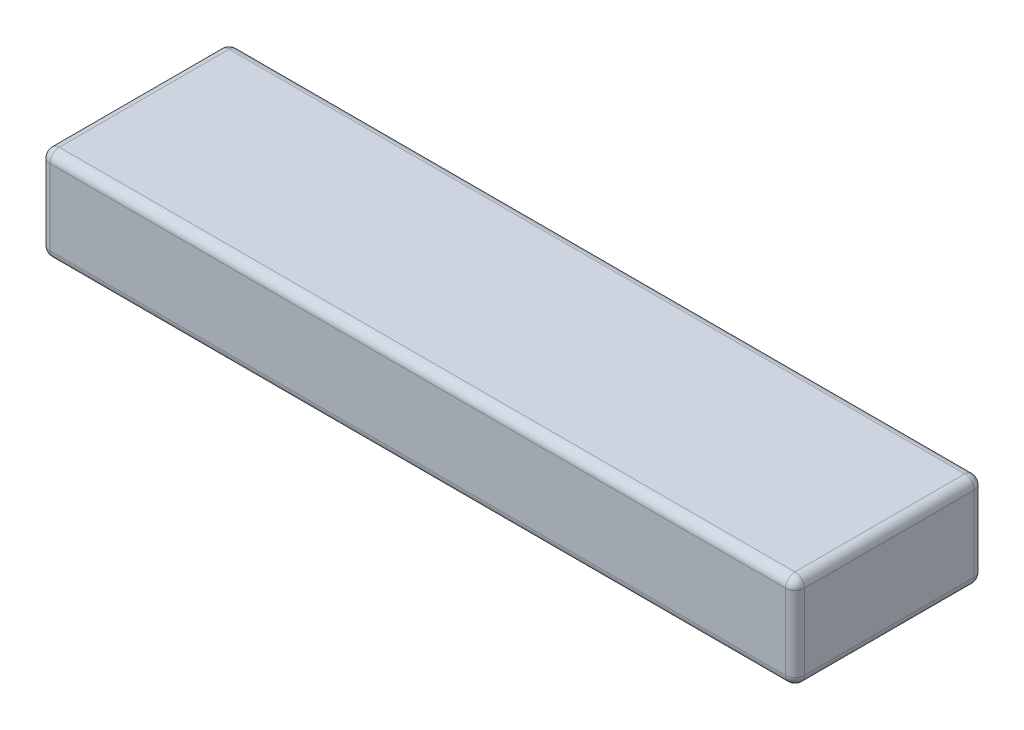
ISO-10303-21;
HEADER;
FILE_DESCRIPTION(('STEP AP214'),'2;1');
FILE_NAME('part.step','',(''),(''),'','','');
FILE_SCHEMA(('AUTOMOTIVE_DESIGN { 1 0 10303 214 1 1 1 1 }'));
ENDSEC;
DATA;
#1=APPLICATION_CONTEXT('core data for automotive mechanical design processes');
#2=APPLICATION_PROTOCOL_DEFINITION('international standard','automotive_design',2000,#1);
#3=PRODUCT_CONTEXT('',#1,'mechanical');
#4=PRODUCT('Part','Part','',(#3));
#5=PRODUCT_RELATED_PRODUCT_CATEGORY('part','',(#4));
#6=PRODUCT_DEFINITION_FORMATION('','',#4);
#7=PRODUCT_DEFINITION_CONTEXT('part definition',#1,'design');
#8=PRODUCT_DEFINITION('design','',#6,#7);
#9=PRODUCT_DEFINITION_SHAPE('','',#8);
#10=(LENGTH_UNIT() NAMED_UNIT(*) SI_UNIT(.MILLI.,.METRE.));
#11=(NAMED_UNIT(*) PLANE_ANGLE_UNIT() SI_UNIT($,.RADIAN.));
#12=(NAMED_UNIT(*) SI_UNIT($,.STERADIAN.) SOLID_ANGLE_UNIT());
#13=UNCERTAINTY_MEASURE_WITH_UNIT(LENGTH_MEASURE(1.E-05),#10,'distance_accuracy_value','');
#14=(GEOMETRIC_REPRESENTATION_CONTEXT(3) GLOBAL_UNCERTAINTY_ASSIGNED_CONTEXT((#13)) GLOBAL_UNIT_ASSIGNED_CONTEXT((#10,
#11,#12)) REPRESENTATION_CONTEXT('',''));
#15=CARTESIAN_POINT('',(0.,0.,0.));
#16=DIRECTION('',(0.,0.,1.));
#17=DIRECTION('',(1.,0.,0.));
#18=AXIS2_PLACEMENT_3D('',#15,#16,#17);
#19=CARTESIAN_POINT('',(-20.,5.,5.));
#20=DIRECTION('',(1.,0.,0.));
#21=DIRECTION('',(0.,0.,-1.));
#22=AXIS2_PLACEMENT_3D('',#19,#20,#21);
#23=PLANE('',#22);
#24=DIRECTION('',(0.,0.,1.));
#25=VECTOR('',#24,1.);
#26=CARTESIAN_POINT('',(-20.,4.5,-5.));
#27=LINE('',#26,#25);
#28=CARTESIAN_POINT('',(-20.,4.5,4.5));
#29=VERTEX_POINT('',#28);
#30=CARTESIAN_POINT('',(-20.,4.5,-4.5));
#31=VERTEX_POINT('',#30);
#32=EDGE_CURVE('E196',#29,#31,#27,.F.);
#33=ORIENTED_EDGE('',*,*,#32,.T.);
#34=DIRECTION('',(0.,-1.,0.));
#35=VECTOR('',#34,1.);
#36=CARTESIAN_POINT('',(-20.,5.,-4.5));
#37=LINE('',#36,#35);
#38=CARTESIAN_POINT('',(-20.,0.5,-4.5));
#39=VERTEX_POINT('',#38);
#40=EDGE_CURVE('E153',#31,#39,#37,.T.);
#41=ORIENTED_EDGE('',*,*,#40,.T.);
#42=DIRECTION('',(0.,0.,1.));
#43=VECTOR('',#42,1.);
#44=CARTESIAN_POINT('',(-20.,0.5,5.));
#45=LINE('',#44,#43);
#46=CARTESIAN_POINT('',(-20.,0.5,4.5));
#47=VERTEX_POINT('',#46);
#48=EDGE_CURVE('E202',#39,#47,#45,.T.);
#49=ORIENTED_EDGE('',*,*,#48,.T.);
#50=DIRECTION('',(0.,-1.,0.));
#51=VECTOR('',#50,1.);
#52=CARTESIAN_POINT('',(-20.,5.,4.5));
#53=LINE('',#52,#51);
#54=EDGE_CURVE('E199',#47,#29,#53,.F.);
#55=ORIENTED_EDGE('',*,*,#54,.T.);
#56=EDGE_LOOP('',(#33,#41,#49,#55));
#57=FACE_BOUND('',#56,.T.);
#58=ADVANCED_FACE('F43',(#57),#23,.F.);
#59=CARTESIAN_POINT('',(20.,5.,5.));
#60=DIRECTION('',(0.,0.,-1.));
#61=DIRECTION('',(-1.,0.,0.));
#62=AXIS2_PLACEMENT_3D('',#59,#60,#61);
#63=PLANE('',#62);
#64=DIRECTION('',(0.,-1.,0.));
#65=VECTOR('',#64,1.);
#66=CARTESIAN_POINT('',(-19.5,5.,5.));
#67=LINE('',#66,#65);
#68=CARTESIAN_POINT('',(-19.5,4.5,5.));
#69=VERTEX_POINT('',#68);
#70=CARTESIAN_POINT('',(-19.5,0.5,5.));
#71=VERTEX_POINT('',#70);
#72=EDGE_CURVE('E226',#69,#71,#67,.T.);
#73=ORIENTED_EDGE('',*,*,#72,.T.);
#74=DIRECTION('',(1.,0.,0.));
#75=VECTOR('',#74,1.);
#76=CARTESIAN_POINT('',(20.,0.5,5.));
#77=LINE('',#76,#75);
#78=CARTESIAN_POINT('',(19.5,0.5,5.));
#79=VERTEX_POINT('',#78);
#80=EDGE_CURVE('E230',#71,#79,#77,.T.);
#81=ORIENTED_EDGE('',*,*,#80,.T.);
#82=DIRECTION('',(0.,-1.,0.));
#83=VECTOR('',#82,1.);
#84=CARTESIAN_POINT('',(19.5,5.,5.));
#85=LINE('',#84,#83);
#86=CARTESIAN_POINT('',(19.5,4.5,5.));
#87=VERTEX_POINT('',#86);
#88=EDGE_CURVE('E223',#79,#87,#85,.F.);
#89=ORIENTED_EDGE('',*,*,#88,.T.);
#90=DIRECTION('',(1.,0.,0.));
#91=VECTOR('',#90,1.);
#92=CARTESIAN_POINT('',(-20.,4.5,5.));
#93=LINE('',#92,#91);
#94=EDGE_CURVE('E220',#87,#69,#93,.F.);
#95=ORIENTED_EDGE('',*,*,#94,.T.);
#96=EDGE_LOOP('',(#73,#81,#89,#95));
#97=FACE_BOUND('',#96,.T.);
#98=ADVANCED_FACE('F333',(#97),#63,.F.);
#99=CARTESIAN_POINT('',(20.,5.,5.));
#100=DIRECTION('',(-1.,0.,0.));
#101=DIRECTION('',(0.,0.,1.));
#102=AXIS2_PLACEMENT_3D('',#99,#100,#101);
#103=PLANE('',#102);
#104=DIRECTION('',(0.,0.,-1.));
#105=VECTOR('',#104,1.);
#106=CARTESIAN_POINT('',(20.,0.5,5.));
#107=LINE('',#106,#105);
#108=CARTESIAN_POINT('',(20.,0.5,4.5));
#109=VERTEX_POINT('',#108);
#110=CARTESIAN_POINT('',(20.,0.5,-4.5));
#111=VERTEX_POINT('',#110);
#112=EDGE_CURVE('E189',#109,#111,#107,.T.);
#113=ORIENTED_EDGE('',*,*,#112,.T.);
#114=DIRECTION('',(0.,-1.,0.));
#115=VECTOR('',#114,1.);
#116=CARTESIAN_POINT('',(20.,5.,-4.5));
#117=LINE('',#116,#115);
#118=CARTESIAN_POINT('',(20.,4.5,-4.5));
#119=VERTEX_POINT('',#118);
#120=EDGE_CURVE('E192',#111,#119,#117,.F.);
#121=ORIENTED_EDGE('',*,*,#120,.T.);
#122=DIRECTION('',(0.,0.,-1.));
#123=VECTOR('',#122,1.);
#124=CARTESIAN_POINT('',(20.,4.5,5.));
#125=LINE('',#124,#123);
#126=CARTESIAN_POINT('',(20.,4.5,4.5));
#127=VERTEX_POINT('',#126);
#128=EDGE_CURVE('E183',#119,#127,#125,.F.);
#129=ORIENTED_EDGE('',*,*,#128,.T.);
#130=DIRECTION('',(0.,-1.,0.));
#131=VECTOR('',#130,1.);
#132=CARTESIAN_POINT('',(20.,5.,4.5));
#133=LINE('',#132,#131);
#134=EDGE_CURVE('E186',#127,#109,#133,.T.);
#135=ORIENTED_EDGE('',*,*,#134,.T.);
#136=EDGE_LOOP('',(#113,#121,#129,#135));
#137=FACE_BOUND('',#136,.T.);
#138=ADVANCED_FACE('F360',(#137),#103,.F.);
#139=CARTESIAN_POINT('',(20.,5.,-5.));
#140=DIRECTION('',(0.,0.,1.));
#141=DIRECTION('',(1.,0.,0.));
#142=AXIS2_PLACEMENT_3D('',#139,#140,#141);
#143=PLANE('',#142);
#144=DIRECTION('',(0.,-1.,0.));
#145=VECTOR('',#144,1.);
#146=CARTESIAN_POINT('',(19.5,5.,-5.));
#147=LINE('',#146,#145);
#148=CARTESIAN_POINT('',(19.5,4.5,-5.));
#149=VERTEX_POINT('',#148);
#150=CARTESIAN_POINT('',(19.5,0.5,-5.));
#151=VERTEX_POINT('',#150);
#152=EDGE_CURVE('E145',#149,#151,#147,.T.);
#153=ORIENTED_EDGE('',*,*,#152,.T.);
#154=DIRECTION('',(-1.,0.,0.));
#155=VECTOR('',#154,1.);
#156=CARTESIAN_POINT('',(20.,0.5,-5.));
#157=LINE('',#156,#155);
#158=CARTESIAN_POINT('',(-19.5,0.5,-5.));
#159=VERTEX_POINT('',#158);
#160=EDGE_CURVE('E140',#151,#159,#157,.T.);
#161=ORIENTED_EDGE('',*,*,#160,.T.);
#162=DIRECTION('',(0.,-1.,0.));
#163=VECTOR('',#162,1.);
#164=CARTESIAN_POINT('',(-19.5,5.,-5.));
#165=LINE('',#164,#163);
#166=CARTESIAN_POINT('',(-19.5,4.5,-5.));
#167=VERTEX_POINT('',#166);
#168=EDGE_CURVE('E132',#159,#167,#165,.F.);
#169=ORIENTED_EDGE('',*,*,#168,.T.);
#170=DIRECTION('',(-1.,0.,0.));
#171=VECTOR('',#170,1.);
#172=CARTESIAN_POINT('',(20.,4.5,-5.));
#173=LINE('',#172,#171);
#174=EDGE_CURVE('E137',#167,#149,#173,.F.);
#175=ORIENTED_EDGE('',*,*,#174,.T.);
#176=EDGE_LOOP('',(#153,#161,#169,#175));
#177=FACE_BOUND('',#176,.T.);
#178=ADVANCED_FACE('F135',(#177),#143,.F.);
#179=CARTESIAN_POINT('',(0.,5.,0.));
#180=DIRECTION('',(0.,1.,0.));
#181=DIRECTION('',(0.,0.,1.));
#182=AXIS2_PLACEMENT_3D('',#179,#180,#181);
#183=PLANE('',#182);
#184=DIRECTION('',(0.,0.,-1.));
#185=VECTOR('',#184,1.);
#186=CARTESIAN_POINT('',(19.5,5.,-5.));
#187=LINE('',#186,#185);
#188=CARTESIAN_POINT('',(19.5,5.,4.5));
#189=VERTEX_POINT('',#188);
#190=CARTESIAN_POINT('',(19.5,5.,-4.5));
#191=VERTEX_POINT('',#190);
#192=EDGE_CURVE('E53',#189,#191,#187,.T.);
#193=ORIENTED_EDGE('',*,*,#192,.T.);
#194=DIRECTION('',(-1.,0.,0.));
#195=VECTOR('',#194,1.);
#196=CARTESIAN_POINT('',(-20.,5.,-4.5));
#197=LINE('',#196,#195);
#198=CARTESIAN_POINT('',(-19.5,5.,-4.5));
#199=VERTEX_POINT('',#198);
#200=EDGE_CURVE('E11',#191,#199,#197,.T.);
#201=ORIENTED_EDGE('',*,*,#200,.T.);
#202=DIRECTION('',(0.,0.,1.));
#203=VECTOR('',#202,1.);
#204=CARTESIAN_POINT('',(-19.5,5.,5.));
#205=LINE('',#204,#203);
#206=CARTESIAN_POINT('',(-19.5,5.,4.5));
#207=VERTEX_POINT('',#206);
#208=EDGE_CURVE('E233',#199,#207,#205,.T.);
#209=ORIENTED_EDGE('',*,*,#208,.T.);
#210=DIRECTION('',(1.,0.,0.));
#211=VECTOR('',#210,1.);
#212=CARTESIAN_POINT('',(20.,5.,4.5));
#213=LINE('',#212,#211);
#214=EDGE_CURVE('E64',#207,#189,#213,.T.);
#215=ORIENTED_EDGE('',*,*,#214,.T.);
#216=EDGE_LOOP('',(#193,#201,#209,#215));
#217=FACE_BOUND('',#216,.T.);
#218=ADVANCED_FACE('F422',(#217),#183,.T.);
#219=CARTESIAN_POINT('',(0.,0.,0.));
#220=DIRECTION('',(0.,1.,0.));
#221=DIRECTION('',(0.,0.,1.));
#222=AXIS2_PLACEMENT_3D('',#219,#220,#221);
#223=PLANE('',#222);
#224=DIRECTION('',(-1.,0.,0.));
#225=VECTOR('',#224,1.);
#226=CARTESIAN_POINT('',(0.,0.,-4.5));
#227=LINE('',#226,#225);
#228=CARTESIAN_POINT('',(-19.5,0.,-4.5));
#229=VERTEX_POINT('',#228);
#230=CARTESIAN_POINT('',(19.5,0.,-4.5));
#231=VERTEX_POINT('',#230);
#232=EDGE_CURVE('E213',#229,#231,#227,.F.);
#233=ORIENTED_EDGE('',*,*,#232,.T.);
#234=DIRECTION('',(0.,0.,-1.));
#235=VECTOR('',#234,1.);
#236=CARTESIAN_POINT('',(19.5,0.,0.));
#237=LINE('',#236,#235);
#238=CARTESIAN_POINT('',(19.5,0.,4.5));
#239=VERTEX_POINT('',#238);
#240=EDGE_CURVE('E216',#231,#239,#237,.F.);
#241=ORIENTED_EDGE('',*,*,#240,.T.);
#242=DIRECTION('',(1.,0.,0.));
#243=VECTOR('',#242,1.);
#244=CARTESIAN_POINT('',(0.,0.,4.5));
#245=LINE('',#244,#243);
#246=CARTESIAN_POINT('',(-19.5,0.,4.5));
#247=VERTEX_POINT('',#246);
#248=EDGE_CURVE('E207',#239,#247,#245,.F.);
#249=ORIENTED_EDGE('',*,*,#248,.T.);
#250=DIRECTION('',(0.,0.,1.));
#251=VECTOR('',#250,1.);
#252=CARTESIAN_POINT('',(-19.5,0.,0.));
#253=LINE('',#252,#251);
#254=EDGE_CURVE('E210',#247,#229,#253,.F.);
#255=ORIENTED_EDGE('',*,*,#254,.T.);
#256=EDGE_LOOP('',(#233,#241,#249,#255));
#257=FACE_BOUND('',#256,.T.);
#258=ADVANCED_FACE('F324',(#257),#223,.F.);
#259=CARTESIAN_POINT('',(-19.5,5.,4.5));
#260=DIRECTION('',(0.,-1.,0.));
#261=DIRECTION('',(0.,0.,-1.));
#262=AXIS2_PLACEMENT_3D('',#259,#260,#261);
#263=CYLINDRICAL_SURFACE('',#262,0.5);
#264=CARTESIAN_POINT('',(-19.5,4.5,4.5));
#265=DIRECTION('',(0.,1.,0.));
#266=DIRECTION('',(0.,0.,1.));
#267=AXIS2_PLACEMENT_3D('',#264,#265,#266);
#268=CIRCLE('',#267,0.5);
#269=EDGE_CURVE('E47',#29,#69,#268,.T.);
#270=ORIENTED_EDGE('',*,*,#269,.F.);
#271=ORIENTED_EDGE('',*,*,#54,.F.);
#272=CARTESIAN_POINT('',(-19.5,0.5,4.5));
#273=DIRECTION('',(0.,-1.,0.));
#274=DIRECTION('',(0.,0.,-1.));
#275=AXIS2_PLACEMENT_3D('',#272,#273,#274);
#276=CIRCLE('',#275,0.5);
#277=EDGE_CURVE('E177',#71,#47,#276,.T.);
#278=ORIENTED_EDGE('',*,*,#277,.F.);
#279=ORIENTED_EDGE('',*,*,#72,.F.);
#280=EDGE_LOOP('',(#270,#271,#278,#279));
#281=FACE_BOUND('',#280,.T.);
#282=ADVANCED_FACE('F45',(#281),#263,.T.);
#283=CARTESIAN_POINT('',(-19.5,4.5,4.5));
#284=DIRECTION('',(0.,0.,1.));
#285=DIRECTION('',(1.,0.,0.));
#286=AXIS2_PLACEMENT_3D('',#283,#284,#285);
#287=SPHERICAL_SURFACE('',#286,0.5);
#288=CARTESIAN_POINT('',(-19.5,4.5,4.5));
#289=DIRECTION('',(0.,0.,1.));
#290=DIRECTION('',(1.,0.,0.));
#291=AXIS2_PLACEMENT_3D('',#288,#289,#290);
#292=CIRCLE('',#291,0.5);
#293=EDGE_CURVE('E300',#29,#207,#292,.F.);
#294=ORIENTED_EDGE('',*,*,#293,.F.);
#295=ORIENTED_EDGE('',*,*,#269,.T.);
#296=CARTESIAN_POINT('',(-19.5,4.5,4.5));
#297=DIRECTION('',(-1.,0.,0.));
#298=DIRECTION('',(0.,0.,1.));
#299=AXIS2_PLACEMENT_3D('',#296,#297,#298);
#300=CIRCLE('',#299,0.5);
#301=EDGE_CURVE('E304',#207,#69,#300,.F.);
#302=ORIENTED_EDGE('',*,*,#301,.F.);
#303=EDGE_LOOP('',(#294,#295,#302));
#304=FACE_BOUND('',#303,.T.);
#305=ADVANCED_FACE('F350',(#304),#287,.T.);
#306=CARTESIAN_POINT('',(-19.5,0.5,4.5));
#307=DIRECTION('',(-1.,0.,0.));
#308=DIRECTION('',(0.,-1.,0.));
#309=AXIS2_PLACEMENT_3D('',#306,#307,#308);
#310=SPHERICAL_SURFACE('',#309,0.5);
#311=CARTESIAN_POINT('',(-19.5,0.5,4.5));
#312=DIRECTION('',(-1.,0.,0.));
#313=DIRECTION('',(0.,0.,1.));
#314=AXIS2_PLACEMENT_3D('',#311,#312,#313);
#315=CIRCLE('',#314,0.5);
#316=EDGE_CURVE('E292',#71,#247,#315,.F.);
#317=ORIENTED_EDGE('',*,*,#316,.F.);
#318=ORIENTED_EDGE('',*,*,#277,.T.);
#319=CARTESIAN_POINT('',(-19.5,0.5,4.5));
#320=DIRECTION('',(0.,0.,1.));
#321=DIRECTION('',(1.,0.,0.));
#322=AXIS2_PLACEMENT_3D('',#319,#320,#321);
#323=CIRCLE('',#322,0.5);
#324=EDGE_CURVE('E296',#247,#47,#323,.F.);
#325=ORIENTED_EDGE('',*,*,#324,.F.);
#326=EDGE_LOOP('',(#317,#318,#325));
#327=FACE_BOUND('',#326,.T.);
#328=ADVANCED_FACE('F313',(#327),#310,.T.);
#329=CARTESIAN_POINT('',(0.,4.5,4.5));
#330=DIRECTION('',(-1.,0.,0.));
#331=DIRECTION('',(0.,0.,1.));
#332=AXIS2_PLACEMENT_3D('',#329,#330,#331);
#333=CYLINDRICAL_SURFACE('',#332,0.5);
#334=ORIENTED_EDGE('',*,*,#301,.T.);
#335=ORIENTED_EDGE('',*,*,#94,.F.);
#336=CARTESIAN_POINT('',(19.5,4.5,4.5));
#337=DIRECTION('',(1.,0.,0.));
#338=DIRECTION('',(0.,0.,-1.));
#339=AXIS2_PLACEMENT_3D('',#336,#337,#338);
#340=CIRCLE('',#339,0.5);
#341=EDGE_CURVE('E284',#189,#87,#340,.T.);
#342=ORIENTED_EDGE('',*,*,#341,.F.);
#343=ORIENTED_EDGE('',*,*,#214,.F.);
#344=EDGE_LOOP('',(#334,#335,#342,#343));
#345=FACE_BOUND('',#344,.T.);
#346=ADVANCED_FACE('F345',(#345),#333,.T.);
#347=CARTESIAN_POINT('',(-19.5,4.5,0.));
#348=DIRECTION('',(0.,0.,-1.));
#349=DIRECTION('',(-1.,0.,0.));
#350=AXIS2_PLACEMENT_3D('',#347,#348,#349);
#351=CYLINDRICAL_SURFACE('',#350,0.5);
#352=ORIENTED_EDGE('',*,*,#293,.T.);
#353=ORIENTED_EDGE('',*,*,#208,.F.);
#354=CARTESIAN_POINT('',(-19.5,4.5,-4.5));
#355=DIRECTION('',(0.,0.,-1.));
#356=DIRECTION('',(-1.,0.,0.));
#357=AXIS2_PLACEMENT_3D('',#354,#355,#356);
#358=CIRCLE('',#357,0.5);
#359=EDGE_CURVE('E158',#31,#199,#358,.T.);
#360=ORIENTED_EDGE('',*,*,#359,.F.);
#361=ORIENTED_EDGE('',*,*,#32,.F.);
#362=EDGE_LOOP('',(#352,#353,#360,#361));
#363=FACE_BOUND('',#362,.T.);
#364=ADVANCED_FACE('F353',(#363),#351,.T.);
#365=CARTESIAN_POINT('',(-19.5,5.,-4.5));
#366=DIRECTION('',(0.,-1.,0.));
#367=DIRECTION('',(0.,0.,-1.));
#368=AXIS2_PLACEMENT_3D('',#365,#366,#367);
#369=CYLINDRICAL_SURFACE('',#368,0.5);
#370=CARTESIAN_POINT('',(-19.5,0.5,-4.5));
#371=DIRECTION('',(0.,-1.,0.));
#372=DIRECTION('',(0.,0.,-1.));
#373=AXIS2_PLACEMENT_3D('',#370,#371,#372);
#374=CIRCLE('',#373,0.5);
#375=EDGE_CURVE('E159',#39,#159,#374,.T.);
#376=ORIENTED_EDGE('',*,*,#375,.F.);
#377=ORIENTED_EDGE('',*,*,#40,.F.);
#378=CARTESIAN_POINT('',(-19.5,4.5,-4.5));
#379=DIRECTION('',(0.,1.,0.));
#380=DIRECTION('',(0.,0.,1.));
#381=AXIS2_PLACEMENT_3D('',#378,#379,#380);
#382=CIRCLE('',#381,0.5);
#383=EDGE_CURVE('E149',#167,#31,#382,.T.);
#384=ORIENTED_EDGE('',*,*,#383,.F.);
#385=ORIENTED_EDGE('',*,*,#168,.F.);
#386=EDGE_LOOP('',(#376,#377,#384,#385));
#387=FACE_BOUND('',#386,.T.);
#388=ADVANCED_FACE('F151',(#387),#369,.T.);
#389=CARTESIAN_POINT('',(-19.5,0.5,5.));
#390=DIRECTION('',(0.,0.,1.));
#391=DIRECTION('',(1.,0.,0.));
#392=AXIS2_PLACEMENT_3D('',#389,#390,#391);
#393=CYLINDRICAL_SURFACE('',#392,0.5);
#394=ORIENTED_EDGE('',*,*,#324,.T.);
#395=ORIENTED_EDGE('',*,*,#48,.F.);
#396=CARTESIAN_POINT('',(-19.5,0.5,-4.5));
#397=DIRECTION('',(0.,0.,-1.));
#398=DIRECTION('',(-1.,0.,0.));
#399=AXIS2_PLACEMENT_3D('',#396,#397,#398);
#400=CIRCLE('',#399,0.5);
#401=EDGE_CURVE('E277',#229,#39,#400,.T.);
#402=ORIENTED_EDGE('',*,*,#401,.F.);
#403=ORIENTED_EDGE('',*,*,#254,.F.);
#404=EDGE_LOOP('',(#394,#395,#402,#403));
#405=FACE_BOUND('',#404,.T.);
#406=ADVANCED_FACE('F320',(#405),#393,.T.);
#407=CARTESIAN_POINT('',(20.,0.5,4.5));
#408=DIRECTION('',(1.,0.,0.));
#409=DIRECTION('',(0.,0.,-1.));
#410=AXIS2_PLACEMENT_3D('',#407,#408,#409);
#411=CYLINDRICAL_SURFACE('',#410,0.5);
#412=ORIENTED_EDGE('',*,*,#316,.T.);
#413=ORIENTED_EDGE('',*,*,#248,.F.);
#414=CARTESIAN_POINT('',(19.5,0.5,4.5));
#415=DIRECTION('',(1.,0.,0.));
#416=DIRECTION('',(0.,0.,-1.));
#417=AXIS2_PLACEMENT_3D('',#414,#415,#416);
#418=CIRCLE('',#417,0.5);
#419=EDGE_CURVE('E273',#79,#239,#418,.T.);
#420=ORIENTED_EDGE('',*,*,#419,.F.);
#421=ORIENTED_EDGE('',*,*,#80,.F.);
#422=EDGE_LOOP('',(#412,#413,#420,#421));
#423=FACE_BOUND('',#422,.T.);
#424=ADVANCED_FACE('F330',(#423),#411,.T.);
#425=CARTESIAN_POINT('',(19.5,5.,4.5));
#426=DIRECTION('',(0.,-1.,0.));
#427=DIRECTION('',(0.,0.,-1.));
#428=AXIS2_PLACEMENT_3D('',#425,#426,#427);
#429=CYLINDRICAL_SURFACE('',#428,0.5);
#430=CARTESIAN_POINT('',(19.5,4.5,4.5));
#431=DIRECTION('',(0.,1.,0.));
#432=DIRECTION('',(0.,0.,1.));
#433=AXIS2_PLACEMENT_3D('',#430,#431,#432);
#434=CIRCLE('',#433,0.5);
#435=EDGE_CURVE('E288',#87,#127,#434,.T.);
#436=ORIENTED_EDGE('',*,*,#435,.F.);
#437=ORIENTED_EDGE('',*,*,#88,.F.);
#438=CARTESIAN_POINT('',(19.5,0.5,4.5));
#439=DIRECTION('',(0.,-1.,0.));
#440=DIRECTION('',(0.,0.,-1.));
#441=AXIS2_PLACEMENT_3D('',#438,#439,#440);
#442=CIRCLE('',#441,0.5);
#443=EDGE_CURVE('E269',#109,#79,#442,.T.);
#444=ORIENTED_EDGE('',*,*,#443,.F.);
#445=ORIENTED_EDGE('',*,*,#134,.F.);
#446=EDGE_LOOP('',(#436,#437,#444,#445));
#447=FACE_BOUND('',#446,.T.);
#448=ADVANCED_FACE('F338',(#447),#429,.T.);
#449=CARTESIAN_POINT('',(19.5,4.5,4.5));
#450=DIRECTION('',(0.,0.,1.));
#451=DIRECTION('',(1.,0.,0.));
#452=AXIS2_PLACEMENT_3D('',#449,#450,#451);
#453=SPHERICAL_SURFACE('',#452,0.5);
#454=ORIENTED_EDGE('',*,*,#341,.T.);
#455=ORIENTED_EDGE('',*,*,#435,.T.);
#456=CARTESIAN_POINT('',(19.5,4.5,4.5));
#457=DIRECTION('',(0.,0.,1.));
#458=DIRECTION('',(1.,0.,0.));
#459=AXIS2_PLACEMENT_3D('',#456,#457,#458);
#460=CIRCLE('',#459,0.5);
#461=EDGE_CURVE('E166',#189,#127,#460,.F.);
#462=ORIENTED_EDGE('',*,*,#461,.F.);
#463=EDGE_LOOP('',(#454,#455,#462));
#464=FACE_BOUND('',#463,.T.);
#465=ADVANCED_FACE('F343',(#464),#453,.T.);
#466=CARTESIAN_POINT('',(-19.5,4.5,-4.5));
#467=DIRECTION('',(-1.,0.,0.));
#468=DIRECTION('',(0.,0.,1.));
#469=AXIS2_PLACEMENT_3D('',#466,#467,#468);
#470=SPHERICAL_SURFACE('',#469,0.5);
#471=ORIENTED_EDGE('',*,*,#383,.T.);
#472=ORIENTED_EDGE('',*,*,#359,.T.);
#473=CARTESIAN_POINT('',(-19.5,4.5,-4.5));
#474=DIRECTION('',(-1.,0.,0.));
#475=DIRECTION('',(0.,0.,1.));
#476=AXIS2_PLACEMENT_3D('',#473,#474,#475);
#477=CIRCLE('',#476,0.5);
#478=EDGE_CURVE('E161',#167,#199,#477,.F.);
#479=ORIENTED_EDGE('',*,*,#478,.F.);
#480=EDGE_LOOP('',(#471,#472,#479));
#481=FACE_BOUND('',#480,.T.);
#482=ADVANCED_FACE('F162',(#481),#470,.T.);
#483=CARTESIAN_POINT('',(-19.5,0.5,-4.5));
#484=DIRECTION('',(-1.,0.,0.));
#485=DIRECTION('',(0.,-1.,0.));
#486=AXIS2_PLACEMENT_3D('',#483,#484,#485);
#487=SPHERICAL_SURFACE('',#486,0.5);
#488=ORIENTED_EDGE('',*,*,#401,.T.);
#489=ORIENTED_EDGE('',*,*,#375,.T.);
#490=CARTESIAN_POINT('',(-19.5,0.5,-4.5));
#491=DIRECTION('',(-1.,0.,0.));
#492=DIRECTION('',(0.,0.,1.));
#493=AXIS2_PLACEMENT_3D('',#490,#491,#492);
#494=CIRCLE('',#493,0.5);
#495=EDGE_CURVE('E167',#229,#159,#494,.F.);
#496=ORIENTED_EDGE('',*,*,#495,.F.);
#497=EDGE_LOOP('',(#488,#489,#496));
#498=FACE_BOUND('',#497,.T.);
#499=ADVANCED_FACE('F393',(#498),#487,.T.);
#500=CARTESIAN_POINT('',(19.5,0.5,4.5));
#501=DIRECTION('',(0.,0.,1.));
#502=DIRECTION('',(0.,-1.,0.));
#503=AXIS2_PLACEMENT_3D('',#500,#501,#502);
#504=SPHERICAL_SURFACE('',#503,0.5);
#505=ORIENTED_EDGE('',*,*,#443,.T.);
#506=ORIENTED_EDGE('',*,*,#419,.T.);
#507=CARTESIAN_POINT('',(19.5,0.5,4.5));
#508=DIRECTION('',(0.,0.,1.));
#509=DIRECTION('',(1.,0.,0.));
#510=AXIS2_PLACEMENT_3D('',#507,#508,#509);
#511=CIRCLE('',#510,0.5);
#512=EDGE_CURVE('E260',#109,#239,#511,.F.);
#513=ORIENTED_EDGE('',*,*,#512,.F.);
#514=EDGE_LOOP('',(#505,#506,#513));
#515=FACE_BOUND('',#514,.T.);
#516=ADVANCED_FACE('F389',(#515),#504,.T.);
#517=CARTESIAN_POINT('',(19.5,4.5,0.));
#518=DIRECTION('',(0.,0.,1.));
#519=DIRECTION('',(1.,0.,0.));
#520=AXIS2_PLACEMENT_3D('',#517,#518,#519);
#521=CYLINDRICAL_SURFACE('',#520,0.5);
#522=ORIENTED_EDGE('',*,*,#461,.T.);
#523=ORIENTED_EDGE('',*,*,#128,.F.);
#524=CARTESIAN_POINT('',(19.5,4.5,-4.5));
#525=DIRECTION('',(0.,0.,-1.));
#526=DIRECTION('',(-1.,0.,0.));
#527=AXIS2_PLACEMENT_3D('',#524,#525,#526);
#528=CIRCLE('',#527,0.5);
#529=EDGE_CURVE('E256',#191,#119,#528,.T.);
#530=ORIENTED_EDGE('',*,*,#529,.F.);
#531=ORIENTED_EDGE('',*,*,#192,.F.);
#532=EDGE_LOOP('',(#522,#523,#530,#531));
#533=FACE_BOUND('',#532,.T.);
#534=ADVANCED_FACE('F386',(#533),#521,.T.);
#535=CARTESIAN_POINT('',(0.,4.5,-4.5));
#536=DIRECTION('',(1.,0.,0.));
#537=DIRECTION('',(0.,0.,-1.));
#538=AXIS2_PLACEMENT_3D('',#535,#536,#537);
#539=CYLINDRICAL_SURFACE('',#538,0.5);
#540=ORIENTED_EDGE('',*,*,#478,.T.);
#541=ORIENTED_EDGE('',*,*,#200,.F.);
#542=CARTESIAN_POINT('',(19.5,4.5,-4.5));
#543=DIRECTION('',(1.,0.,0.));
#544=DIRECTION('',(0.,0.,-1.));
#545=AXIS2_PLACEMENT_3D('',#542,#543,#544);
#546=CIRCLE('',#545,0.5);
#547=EDGE_CURVE('E171',#149,#191,#546,.T.);
#548=ORIENTED_EDGE('',*,*,#547,.F.);
#549=ORIENTED_EDGE('',*,*,#174,.F.);
#550=EDGE_LOOP('',(#540,#541,#548,#549));
#551=FACE_BOUND('',#550,.T.);
#552=ADVANCED_FACE('F169',(#551),#539,.T.);
#553=CARTESIAN_POINT('',(20.,0.5,-4.5));
#554=DIRECTION('',(-1.,0.,0.));
#555=DIRECTION('',(0.,0.,1.));
#556=AXIS2_PLACEMENT_3D('',#553,#554,#555);
#557=CYLINDRICAL_SURFACE('',#556,0.5);
#558=ORIENTED_EDGE('',*,*,#495,.T.);
#559=ORIENTED_EDGE('',*,*,#160,.F.);
#560=CARTESIAN_POINT('',(19.5,0.5,-4.5));
#561=DIRECTION('',(1.,0.,0.));
#562=DIRECTION('',(0.,0.,-1.));
#563=AXIS2_PLACEMENT_3D('',#560,#561,#562);
#564=CIRCLE('',#563,0.5);
#565=EDGE_CURVE('E250',#231,#151,#564,.T.);
#566=ORIENTED_EDGE('',*,*,#565,.F.);
#567=ORIENTED_EDGE('',*,*,#232,.F.);
#568=EDGE_LOOP('',(#558,#559,#566,#567));
#569=FACE_BOUND('',#568,.T.);
#570=ADVANCED_FACE('F379',(#569),#557,.T.);
#571=CARTESIAN_POINT('',(19.5,0.5,5.));
#572=DIRECTION('',(0.,0.,-1.));
#573=DIRECTION('',(-1.,0.,0.));
#574=AXIS2_PLACEMENT_3D('',#571,#572,#573);
#575=CYLINDRICAL_SURFACE('',#574,0.5);
#576=ORIENTED_EDGE('',*,*,#512,.T.);
#577=ORIENTED_EDGE('',*,*,#240,.F.);
#578=CARTESIAN_POINT('',(19.5,0.5,-4.5));
#579=DIRECTION('',(0.,0.,-1.));
#580=DIRECTION('',(-1.,0.,0.));
#581=AXIS2_PLACEMENT_3D('',#578,#579,#580);
#582=CIRCLE('',#581,0.5);
#583=EDGE_CURVE('E246',#111,#231,#582,.T.);
#584=ORIENTED_EDGE('',*,*,#583,.F.);
#585=ORIENTED_EDGE('',*,*,#112,.F.);
#586=EDGE_LOOP('',(#576,#577,#584,#585));
#587=FACE_BOUND('',#586,.T.);
#588=ADVANCED_FACE('F375',(#587),#575,.T.);
#589=CARTESIAN_POINT('',(19.5,4.5,-4.5));
#590=DIRECTION('',(0.,1.,0.));
#591=DIRECTION('',(0.,0.,1.));
#592=AXIS2_PLACEMENT_3D('',#589,#590,#591);
#593=SPHERICAL_SURFACE('',#592,0.5);
#594=ORIENTED_EDGE('',*,*,#547,.T.);
#595=ORIENTED_EDGE('',*,*,#529,.T.);
#596=CARTESIAN_POINT('',(19.5,4.5,-4.5));
#597=DIRECTION('',(0.,1.,0.));
#598=DIRECTION('',(0.,0.,1.));
#599=AXIS2_PLACEMENT_3D('',#596,#597,#598);
#600=CIRCLE('',#599,0.5);
#601=EDGE_CURVE('E243',#149,#119,#600,.F.);
#602=ORIENTED_EDGE('',*,*,#601,.F.);
#603=EDGE_LOOP('',(#594,#595,#602));
#604=FACE_BOUND('',#603,.T.);
#605=ADVANCED_FACE('F371',(#604),#593,.T.);
#606=CARTESIAN_POINT('',(19.5,0.5,-4.5));
#607=DIRECTION('',(0.,-1.,0.));
#608=DIRECTION('',(0.,0.,-1.));
#609=AXIS2_PLACEMENT_3D('',#606,#607,#608);
#610=SPHERICAL_SURFACE('',#609,0.5);
#611=ORIENTED_EDGE('',*,*,#583,.T.);
#612=ORIENTED_EDGE('',*,*,#565,.T.);
#613=CARTESIAN_POINT('',(19.5,0.5,-4.5));
#614=DIRECTION('',(0.,-1.,0.));
#615=DIRECTION('',(0.,0.,-1.));
#616=AXIS2_PLACEMENT_3D('',#613,#614,#615);
#617=CIRCLE('',#616,0.5);
#618=EDGE_CURVE('E240',#111,#151,#617,.F.);
#619=ORIENTED_EDGE('',*,*,#618,.F.);
#620=EDGE_LOOP('',(#611,#612,#619));
#621=FACE_BOUND('',#620,.T.);
#622=ADVANCED_FACE('F367',(#621),#610,.T.);
#623=CARTESIAN_POINT('',(19.5,5.,-4.5));
#624=DIRECTION('',(0.,-1.,0.));
#625=DIRECTION('',(0.,0.,-1.));
#626=AXIS2_PLACEMENT_3D('',#623,#624,#625);
#627=CYLINDRICAL_SURFACE('',#626,0.5);
#628=ORIENTED_EDGE('',*,*,#601,.T.);
#629=ORIENTED_EDGE('',*,*,#120,.F.);
#630=ORIENTED_EDGE('',*,*,#618,.T.);
#631=ORIENTED_EDGE('',*,*,#152,.F.);
#632=EDGE_LOOP('',(#628,#629,#630,#631));
#633=FACE_BOUND('',#632,.T.);
#634=ADVANCED_FACE('F364',(#633),#627,.T.);
#635=CLOSED_SHELL('',(#58,#98,#138,#178,#218,#258,#282,#305,#328,#346,#364,#388,#406,#424,#448,
#465,#482,#499,#516,#534,#552,#570,#588,#605,#622,#634));
#636=MANIFOLD_SOLID_BREP('B2',#635);
#637=ADVANCED_BREP_SHAPE_REPRESENTATION('',(#18,#636),#14);
#638=SHAPE_DEFINITION_REPRESENTATION(#9,#637);
ENDSEC;
END-ISO-10303-21;
